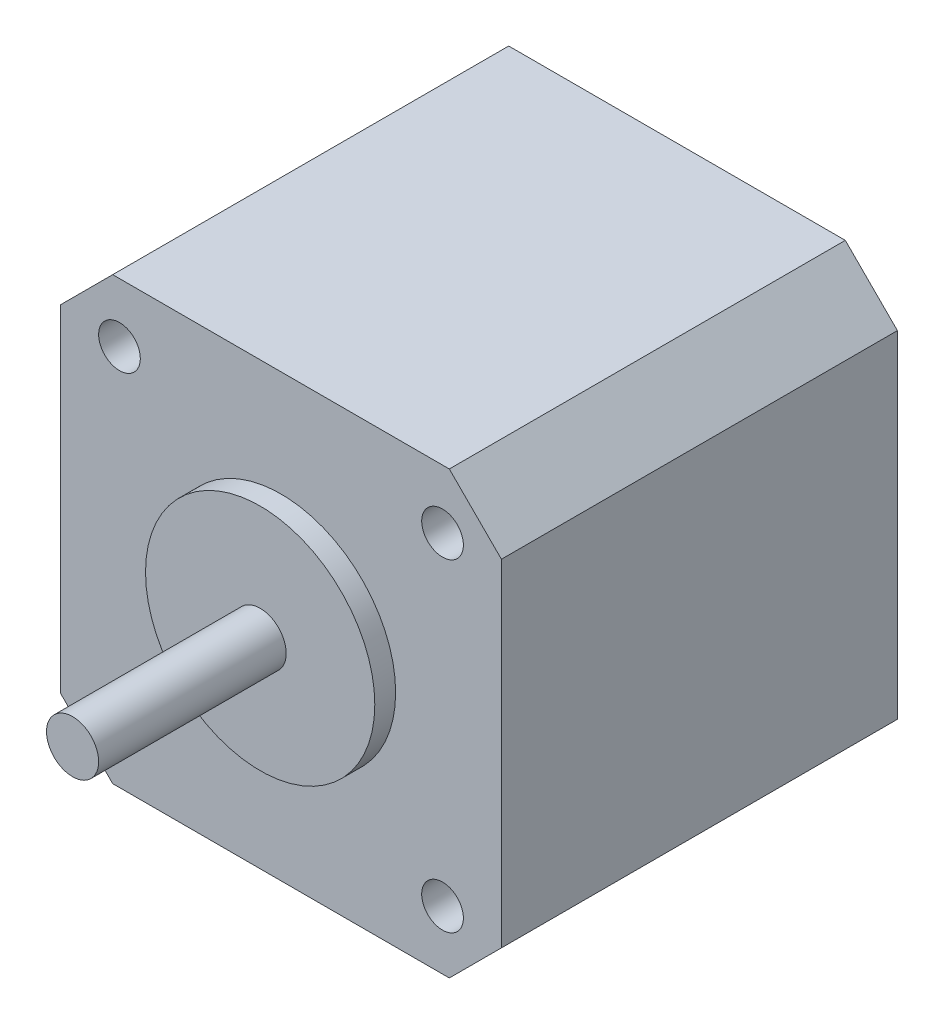
ISO-10303-21;
HEADER;
FILE_DESCRIPTION(('STEP AP214'),'2;1');
FILE_NAME('part.step','',(''),(''),'','','');
FILE_SCHEMA(('AUTOMOTIVE_DESIGN { 1 0 10303 214 1 1 1 1 }'));
ENDSEC;
DATA;
#1=APPLICATION_CONTEXT('core data for automotive mechanical design processes');
#2=APPLICATION_PROTOCOL_DEFINITION('international standard','automotive_design',2000,#1);
#3=PRODUCT_CONTEXT('',#1,'mechanical');
#4=PRODUCT('Part','Part','',(#3));
#5=PRODUCT_RELATED_PRODUCT_CATEGORY('part','',(#4));
#6=PRODUCT_DEFINITION_FORMATION('','',#4);
#7=PRODUCT_DEFINITION_CONTEXT('part definition',#1,'design');
#8=PRODUCT_DEFINITION('design','',#6,#7);
#9=PRODUCT_DEFINITION_SHAPE('','',#8);
#10=(LENGTH_UNIT() NAMED_UNIT(*) SI_UNIT(.MILLI.,.METRE.));
#11=(NAMED_UNIT(*) PLANE_ANGLE_UNIT() SI_UNIT($,.RADIAN.));
#12=(NAMED_UNIT(*) SI_UNIT($,.STERADIAN.) SOLID_ANGLE_UNIT());
#13=UNCERTAINTY_MEASURE_WITH_UNIT(LENGTH_MEASURE(1.E-05),#10,'distance_accuracy_value','');
#14=(GEOMETRIC_REPRESENTATION_CONTEXT(3) GLOBAL_UNCERTAINTY_ASSIGNED_CONTEXT((#13)) GLOBAL_UNIT_ASSIGNED_CONTEXT((#10,
#11,#12)) REPRESENTATION_CONTEXT('',''));
#15=CARTESIAN_POINT('',(0.,0.,0.));
#16=DIRECTION('',(0.,0.,1.));
#17=DIRECTION('',(1.,0.,0.));
#18=AXIS2_PLACEMENT_3D('',#15,#16,#17);
#19=CARTESIAN_POINT('',(21.15,-21.15,38.));
#20=DIRECTION('',(-1.,0.,0.));
#21=DIRECTION('',(0.,0.,1.));
#22=AXIS2_PLACEMENT_3D('',#19,#20,#21);
#23=PLANE('',#22);
#24=DIRECTION('',(0.,1.,0.));
#25=VECTOR('',#24,1.);
#26=CARTESIAN_POINT('',(21.15,-21.15,38.));
#27=LINE('',#26,#25);
#28=CARTESIAN_POINT('',(21.15,-16.15,38.));
#29=VERTEX_POINT('',#28);
#30=CARTESIAN_POINT('',(21.15,16.15,38.));
#31=VERTEX_POINT('',#30);
#32=EDGE_CURVE('E122',#29,#31,#27,.T.);
#33=ORIENTED_EDGE('',*,*,#32,.F.);
#34=DIRECTION('',(0.,0.,-1.));
#35=VECTOR('',#34,1.);
#36=CARTESIAN_POINT('',(21.15,-16.15,0.));
#37=LINE('',#36,#35);
#38=CARTESIAN_POINT('',(21.15,-16.15,0.));
#39=VERTEX_POINT('',#38);
#40=EDGE_CURVE('E107',#29,#39,#37,.T.);
#41=ORIENTED_EDGE('',*,*,#40,.T.);
#42=DIRECTION('',(0.,1.,0.));
#43=VECTOR('',#42,1.);
#44=CARTESIAN_POINT('',(21.15,-21.15,0.));
#45=LINE('',#44,#43);
#46=CARTESIAN_POINT('',(21.15,16.15,0.));
#47=VERTEX_POINT('',#46);
#48=EDGE_CURVE('E119',#39,#47,#45,.T.);
#49=ORIENTED_EDGE('',*,*,#48,.T.);
#50=DIRECTION('',(0.,0.,1.));
#51=VECTOR('',#50,1.);
#52=CARTESIAN_POINT('',(21.15,16.15,38.));
#53=LINE('',#52,#51);
#54=EDGE_CURVE('E124',#47,#31,#53,.T.);
#55=ORIENTED_EDGE('',*,*,#54,.T.);
#56=EDGE_LOOP('',(#33,#41,#49,#55));
#57=FACE_BOUND('',#56,.T.);
#58=ADVANCED_FACE('F34',(#57),#23,.F.);
#59=CARTESIAN_POINT('',(21.15,21.15,38.));
#60=DIRECTION('',(0.,-1.,0.));
#61=DIRECTION('',(1.,0.,0.));
#62=AXIS2_PLACEMENT_3D('',#59,#60,#61);
#63=PLANE('',#62);
#64=DIRECTION('',(-1.,0.,0.));
#65=VECTOR('',#64,1.);
#66=CARTESIAN_POINT('',(21.15,21.15,0.));
#67=LINE('',#66,#65);
#68=CARTESIAN_POINT('',(16.15,21.15,0.));
#69=VERTEX_POINT('',#68);
#70=CARTESIAN_POINT('',(-16.15,21.15,0.));
#71=VERTEX_POINT('',#70);
#72=EDGE_CURVE('E128',#69,#71,#67,.T.);
#73=ORIENTED_EDGE('',*,*,#72,.T.);
#74=DIRECTION('',(0.,0.,1.));
#75=VECTOR('',#74,1.);
#76=CARTESIAN_POINT('',(-16.15,21.15,38.));
#77=LINE('',#76,#75);
#78=CARTESIAN_POINT('',(-16.15,21.15,38.));
#79=VERTEX_POINT('',#78);
#80=EDGE_CURVE('E38',#71,#79,#77,.T.);
#81=ORIENTED_EDGE('',*,*,#80,.T.);
#82=DIRECTION('',(-1.,0.,0.));
#83=VECTOR('',#82,1.);
#84=CARTESIAN_POINT('',(21.15,21.15,38.));
#85=LINE('',#84,#83);
#86=CARTESIAN_POINT('',(16.15,21.15,38.));
#87=VERTEX_POINT('',#86);
#88=EDGE_CURVE('E197',#87,#79,#85,.T.);
#89=ORIENTED_EDGE('',*,*,#88,.F.);
#90=DIRECTION('',(0.,0.,-1.));
#91=VECTOR('',#90,1.);
#92=CARTESIAN_POINT('',(16.15,21.15,38.));
#93=LINE('',#92,#91);
#94=EDGE_CURVE('E163',#87,#69,#93,.T.);
#95=ORIENTED_EDGE('',*,*,#94,.T.);
#96=EDGE_LOOP('',(#73,#81,#89,#95));
#97=FACE_BOUND('',#96,.T.);
#98=ADVANCED_FACE('F211',(#97),#63,.F.);
#99=CARTESIAN_POINT('',(-21.15,-21.15,38.));
#100=DIRECTION('',(-1.,0.,0.));
#101=DIRECTION('',(0.,0.,1.));
#102=AXIS2_PLACEMENT_3D('',#99,#100,#101);
#103=PLANE('',#102);
#104=DIRECTION('',(0.,1.,0.));
#105=VECTOR('',#104,1.);
#106=CARTESIAN_POINT('',(-21.15,-21.15,0.));
#107=LINE('',#106,#105);
#108=CARTESIAN_POINT('',(-21.15,-16.15,0.));
#109=VERTEX_POINT('',#108);
#110=CARTESIAN_POINT('',(-21.15,16.15,0.));
#111=VERTEX_POINT('',#110);
#112=EDGE_CURVE('E132',#109,#111,#107,.T.);
#113=ORIENTED_EDGE('',*,*,#112,.F.);
#114=DIRECTION('',(0.,0.,1.));
#115=VECTOR('',#114,1.);
#116=CARTESIAN_POINT('',(-21.15,-16.15,38.));
#117=LINE('',#116,#115);
#118=CARTESIAN_POINT('',(-21.15,-16.15,38.));
#119=VERTEX_POINT('',#118);
#120=EDGE_CURVE('E58',#109,#119,#117,.T.);
#121=ORIENTED_EDGE('',*,*,#120,.T.);
#122=DIRECTION('',(0.,1.,0.));
#123=VECTOR('',#122,1.);
#124=CARTESIAN_POINT('',(-21.15,-21.15,38.));
#125=LINE('',#124,#123);
#126=CARTESIAN_POINT('',(-21.15,16.15,38.));
#127=VERTEX_POINT('',#126);
#128=EDGE_CURVE('E198',#119,#127,#125,.T.);
#129=ORIENTED_EDGE('',*,*,#128,.T.);
#130=DIRECTION('',(0.,0.,-1.));
#131=VECTOR('',#130,1.);
#132=CARTESIAN_POINT('',(-21.15,16.15,0.));
#133=LINE('',#132,#131);
#134=EDGE_CURVE('E160',#127,#111,#133,.T.);
#135=ORIENTED_EDGE('',*,*,#134,.T.);
#136=EDGE_LOOP('',(#113,#121,#129,#135));
#137=FACE_BOUND('',#136,.T.);
#138=ADVANCED_FACE('F208',(#137),#103,.T.);
#139=CARTESIAN_POINT('',(21.15,-21.15,38.));
#140=DIRECTION('',(0.,-1.,0.));
#141=DIRECTION('',(1.,0.,0.));
#142=AXIS2_PLACEMENT_3D('',#139,#140,#141);
#143=PLANE('',#142);
#144=DIRECTION('',(-1.,0.,0.));
#145=VECTOR('',#144,1.);
#146=CARTESIAN_POINT('',(21.15,-21.15,0.));
#147=LINE('',#146,#145);
#148=CARTESIAN_POINT('',(16.15,-21.15,0.));
#149=VERTEX_POINT('',#148);
#150=CARTESIAN_POINT('',(-16.15,-21.15,0.));
#151=VERTEX_POINT('',#150);
#152=EDGE_CURVE('E143',#149,#151,#147,.T.);
#153=ORIENTED_EDGE('',*,*,#152,.F.);
#154=DIRECTION('',(0.,0.,1.));
#155=VECTOR('',#154,1.);
#156=CARTESIAN_POINT('',(16.15,-21.15,38.));
#157=LINE('',#156,#155);
#158=CARTESIAN_POINT('',(16.15,-21.15,38.));
#159=VERTEX_POINT('',#158);
#160=EDGE_CURVE('E108',#149,#159,#157,.T.);
#161=ORIENTED_EDGE('',*,*,#160,.T.);
#162=DIRECTION('',(-1.,0.,0.));
#163=VECTOR('',#162,1.);
#164=CARTESIAN_POINT('',(21.15,-21.15,38.));
#165=LINE('',#164,#163);
#166=CARTESIAN_POINT('',(-16.15,-21.15,38.));
#167=VERTEX_POINT('',#166);
#168=EDGE_CURVE('E138',#159,#167,#165,.T.);
#169=ORIENTED_EDGE('',*,*,#168,.T.);
#170=DIRECTION('',(0.,0.,-1.));
#171=VECTOR('',#170,1.);
#172=CARTESIAN_POINT('',(-16.15,-21.15,38.));
#173=LINE('',#172,#171);
#174=EDGE_CURVE('E113',#167,#151,#173,.T.);
#175=ORIENTED_EDGE('',*,*,#174,.T.);
#176=EDGE_LOOP('',(#153,#161,#169,#175));
#177=FACE_BOUND('',#176,.T.);
#178=ADVANCED_FACE('F204',(#177),#143,.T.);
#179=CARTESIAN_POINT('',(0.,0.,38.));
#180=DIRECTION('',(0.,0.,1.));
#181=DIRECTION('',(1.,0.,0.));
#182=AXIS2_PLACEMENT_3D('',#179,#180,#181);
#183=PLANE('',#182);
#184=CARTESIAN_POINT('',(0.,0.,38.));
#185=DIRECTION('',(0.,0.,1.));
#186=DIRECTION('',(1.,0.,0.));
#187=AXIS2_PLACEMENT_3D('',#184,#185,#186);
#188=CIRCLE('',#187,11.);
#189=CARTESIAN_POINT('',(11.,0.,38.));
#190=VERTEX_POINT('',#189);
#191=EDGE_CURVE('E43',#190,#190,#188,.T.);
#192=ORIENTED_EDGE('',*,*,#191,.F.);
#193=EDGE_LOOP('',(#192));
#194=FACE_BOUND('',#193,.T.);
#195=CARTESIAN_POINT('',(15.5,15.5,38.));
#196=DIRECTION('',(0.,0.,1.));
#197=DIRECTION('',(1.,0.,0.));
#198=AXIS2_PLACEMENT_3D('',#195,#196,#197);
#199=CIRCLE('',#198,2.);
#200=CARTESIAN_POINT('',(17.5,15.5,38.));
#201=VERTEX_POINT('',#200);
#202=EDGE_CURVE('E186',#201,#201,#199,.T.);
#203=ORIENTED_EDGE('',*,*,#202,.F.);
#204=EDGE_LOOP('',(#203));
#205=FACE_BOUND('',#204,.T.);
#206=CARTESIAN_POINT('',(-15.5,-15.5,38.));
#207=DIRECTION('',(0.,0.,1.));
#208=DIRECTION('',(1.,0.,0.));
#209=AXIS2_PLACEMENT_3D('',#206,#207,#208);
#210=CIRCLE('',#209,2.);
#211=CARTESIAN_POINT('',(-13.5,-15.5,38.));
#212=VERTEX_POINT('',#211);
#213=EDGE_CURVE('E179',#212,#212,#210,.T.);
#214=ORIENTED_EDGE('',*,*,#213,.F.);
#215=EDGE_LOOP('',(#214));
#216=FACE_BOUND('',#215,.T.);
#217=CARTESIAN_POINT('',(15.5,-15.5,38.));
#218=DIRECTION('',(0.,0.,1.));
#219=DIRECTION('',(1.,0.,0.));
#220=AXIS2_PLACEMENT_3D('',#217,#218,#219);
#221=CIRCLE('',#220,2.);
#222=CARTESIAN_POINT('',(17.5,-15.5,38.));
#223=VERTEX_POINT('',#222);
#224=EDGE_CURVE('E180',#223,#223,#221,.T.);
#225=ORIENTED_EDGE('',*,*,#224,.F.);
#226=EDGE_LOOP('',(#225));
#227=FACE_BOUND('',#226,.T.);
#228=CARTESIAN_POINT('',(-15.5,15.5,38.));
#229=DIRECTION('',(0.,0.,1.));
#230=DIRECTION('',(1.,0.,0.));
#231=AXIS2_PLACEMENT_3D('',#228,#229,#230);
#232=CIRCLE('',#231,2.);
#233=CARTESIAN_POINT('',(-13.5,15.5,38.));
#234=VERTEX_POINT('',#233);
#235=EDGE_CURVE('E135',#234,#234,#232,.T.);
#236=ORIENTED_EDGE('',*,*,#235,.F.);
#237=EDGE_LOOP('',(#236));
#238=FACE_BOUND('',#237,.T.);
#239=ORIENTED_EDGE('',*,*,#168,.F.);
#240=DIRECTION('',(0.707106781186549,0.707106781186546,0.));
#241=VECTOR('',#240,1.);
#242=CARTESIAN_POINT('',(18.65,-18.65,38.));
#243=LINE('',#242,#241);
#244=EDGE_CURVE('E158',#159,#29,#243,.T.);
#245=ORIENTED_EDGE('',*,*,#244,.T.);
#246=ORIENTED_EDGE('',*,*,#32,.T.);
#247=DIRECTION('',(0.707106781186546,-0.707106781186549,0.));
#248=VECTOR('',#247,1.);
#249=CARTESIAN_POINT('',(18.65,18.65,38.));
#250=LINE('',#249,#248);
#251=EDGE_CURVE('E153',#31,#87,#250,.F.);
#252=ORIENTED_EDGE('',*,*,#251,.T.);
#253=ORIENTED_EDGE('',*,*,#88,.T.);
#254=DIRECTION('',(-0.707106781186549,-0.707106781186546,0.));
#255=VECTOR('',#254,1.);
#256=CARTESIAN_POINT('',(-18.65,18.65,38.));
#257=LINE('',#256,#255);
#258=EDGE_CURVE('E51',#79,#127,#257,.T.);
#259=ORIENTED_EDGE('',*,*,#258,.T.);
#260=ORIENTED_EDGE('',*,*,#128,.F.);
#261=DIRECTION('',(-0.707106781186547,0.707106781186549,0.));
#262=VECTOR('',#261,1.);
#263=CARTESIAN_POINT('',(-18.65,-18.65,38.));
#264=LINE('',#263,#262);
#265=EDGE_CURVE('E156',#119,#167,#264,.F.);
#266=ORIENTED_EDGE('',*,*,#265,.T.);
#267=EDGE_LOOP('',(#239,#245,#246,#252,#253,#259,#260,#266));
#268=FACE_BOUND('',#267,.T.);
#269=ADVANCED_FACE('F238',(#194,#205,#216,#227,#238,#268),#183,.T.);
#270=CARTESIAN_POINT('',(0.,0.,0.));
#271=DIRECTION('',(0.,0.,1.));
#272=DIRECTION('',(1.,0.,0.));
#273=AXIS2_PLACEMENT_3D('',#270,#271,#272);
#274=PLANE('',#273);
#275=ORIENTED_EDGE('',*,*,#48,.F.);
#276=DIRECTION('',(-0.707106781186549,-0.707106781186546,0.));
#277=VECTOR('',#276,1.);
#278=CARTESIAN_POINT('',(21.15,-16.15,0.));
#279=LINE('',#278,#277);
#280=EDGE_CURVE('E103',#39,#149,#279,.T.);
#281=ORIENTED_EDGE('',*,*,#280,.T.);
#282=ORIENTED_EDGE('',*,*,#152,.T.);
#283=DIRECTION('',(0.707106781186547,-0.707106781186549,0.));
#284=VECTOR('',#283,1.);
#285=CARTESIAN_POINT('',(-16.15,-21.15,0.));
#286=LINE('',#285,#284);
#287=EDGE_CURVE('E114',#151,#109,#286,.F.);
#288=ORIENTED_EDGE('',*,*,#287,.T.);
#289=ORIENTED_EDGE('',*,*,#112,.T.);
#290=DIRECTION('',(0.707106781186549,0.707106781186546,0.));
#291=VECTOR('',#290,1.);
#292=CARTESIAN_POINT('',(-21.15,16.15,0.));
#293=LINE('',#292,#291);
#294=EDGE_CURVE('E147',#111,#71,#293,.T.);
#295=ORIENTED_EDGE('',*,*,#294,.T.);
#296=ORIENTED_EDGE('',*,*,#72,.F.);
#297=DIRECTION('',(-0.707106781186546,0.707106781186549,0.));
#298=VECTOR('',#297,1.);
#299=CARTESIAN_POINT('',(16.15,21.15,0.));
#300=LINE('',#299,#298);
#301=EDGE_CURVE('E123',#69,#47,#300,.F.);
#302=ORIENTED_EDGE('',*,*,#301,.T.);
#303=EDGE_LOOP('',(#275,#281,#282,#288,#289,#295,#296,#302));
#304=FACE_BOUND('',#303,.T.);
#305=ADVANCED_FACE('F126',(#304),#274,.F.);
#306=CARTESIAN_POINT('',(21.15,-16.15,38.));
#307=DIRECTION('',(0.707106781186546,-0.707106781186549,0.));
#308=DIRECTION('',(0.,0.,1.));
#309=AXIS2_PLACEMENT_3D('',#306,#307,#308);
#310=PLANE('',#309);
#311=ORIENTED_EDGE('',*,*,#244,.F.);
#312=ORIENTED_EDGE('',*,*,#160,.F.);
#313=ORIENTED_EDGE('',*,*,#280,.F.);
#314=ORIENTED_EDGE('',*,*,#40,.F.);
#315=EDGE_LOOP('',(#311,#312,#313,#314));
#316=FACE_BOUND('',#315,.T.);
#317=ADVANCED_FACE('F106',(#316),#310,.T.);
#318=CARTESIAN_POINT('',(-16.15,-21.15,38.));
#319=DIRECTION('',(0.707106781186548,0.707106781186546,0.));
#320=DIRECTION('',(0.,0.,-1.));
#321=AXIS2_PLACEMENT_3D('',#318,#319,#320);
#322=PLANE('',#321);
#323=ORIENTED_EDGE('',*,*,#265,.F.);
#324=ORIENTED_EDGE('',*,*,#120,.F.);
#325=ORIENTED_EDGE('',*,*,#287,.F.);
#326=ORIENTED_EDGE('',*,*,#174,.F.);
#327=EDGE_LOOP('',(#323,#324,#325,#326));
#328=FACE_BOUND('',#327,.T.);
#329=ADVANCED_FACE('F207',(#328),#322,.F.);
#330=CARTESIAN_POINT('',(-21.15,16.15,38.));
#331=DIRECTION('',(-0.707106781186546,0.707106781186549,0.));
#332=DIRECTION('',(0.,0.,1.));
#333=AXIS2_PLACEMENT_3D('',#330,#331,#332);
#334=PLANE('',#333);
#335=ORIENTED_EDGE('',*,*,#258,.F.);
#336=ORIENTED_EDGE('',*,*,#80,.F.);
#337=ORIENTED_EDGE('',*,*,#294,.F.);
#338=ORIENTED_EDGE('',*,*,#134,.F.);
#339=EDGE_LOOP('',(#335,#336,#337,#338));
#340=FACE_BOUND('',#339,.T.);
#341=ADVANCED_FACE('F210',(#340),#334,.T.);
#342=CARTESIAN_POINT('',(16.15,21.15,38.));
#343=DIRECTION('',(-0.707106781186549,-0.707106781186546,0.));
#344=DIRECTION('',(0.,0.,-1.));
#345=AXIS2_PLACEMENT_3D('',#342,#343,#344);
#346=PLANE('',#345);
#347=ORIENTED_EDGE('',*,*,#251,.F.);
#348=ORIENTED_EDGE('',*,*,#54,.F.);
#349=ORIENTED_EDGE('',*,*,#301,.F.);
#350=ORIENTED_EDGE('',*,*,#94,.F.);
#351=EDGE_LOOP('',(#347,#348,#349,#350));
#352=FACE_BOUND('',#351,.T.);
#353=ADVANCED_FACE('F36',(#352),#346,.F.);
#354=CARTESIAN_POINT('',(-15.5,15.5,33.));
#355=DIRECTION('',(0.,0.,1.));
#356=DIRECTION('',(1.,0.,0.));
#357=AXIS2_PLACEMENT_3D('',#354,#355,#356);
#358=CYLINDRICAL_SURFACE('',#357,2.);
#359=CARTESIAN_POINT('',(-15.5,15.5,33.));
#360=DIRECTION('',(0.,0.,1.));
#361=DIRECTION('',(1.,0.,0.));
#362=AXIS2_PLACEMENT_3D('',#359,#360,#361);
#363=CIRCLE('',#362,2.);
#364=CARTESIAN_POINT('',(-13.5,15.5,33.));
#365=VERTEX_POINT('',#364);
#366=EDGE_CURVE('E129',#365,#365,#363,.T.);
#367=ORIENTED_EDGE('',*,*,#366,.F.);
#368=EDGE_LOOP('',(#367));
#369=FACE_BOUND('',#368,.T.);
#370=ORIENTED_EDGE('',*,*,#235,.T.);
#371=EDGE_LOOP('',(#370));
#372=FACE_BOUND('',#371,.T.);
#373=ADVANCED_FACE('F229',(#369,#372),#358,.F.);
#374=CARTESIAN_POINT('',(-15.5,15.5,33.));
#375=DIRECTION('',(0.,0.,1.));
#376=DIRECTION('',(1.,0.,0.));
#377=AXIS2_PLACEMENT_3D('',#374,#375,#376);
#378=PLANE('',#377);
#379=ORIENTED_EDGE('',*,*,#366,.T.);
#380=EDGE_LOOP('',(#379));
#381=FACE_BOUND('',#380,.T.);
#382=ADVANCED_FACE('F234',(#381),#378,.T.);
#383=CARTESIAN_POINT('',(15.5,-15.5,33.));
#384=DIRECTION('',(0.,0.,1.));
#385=DIRECTION('',(1.,0.,0.));
#386=AXIS2_PLACEMENT_3D('',#383,#384,#385);
#387=CYLINDRICAL_SURFACE('',#386,2.);
#388=CARTESIAN_POINT('',(15.5,-15.5,33.));
#389=DIRECTION('',(0.,0.,1.));
#390=DIRECTION('',(1.,0.,0.));
#391=AXIS2_PLACEMENT_3D('',#388,#389,#390);
#392=CIRCLE('',#391,2.);
#393=CARTESIAN_POINT('',(17.5,-15.5,33.));
#394=VERTEX_POINT('',#393);
#395=EDGE_CURVE('E176',#394,#394,#392,.T.);
#396=ORIENTED_EDGE('',*,*,#395,.F.);
#397=EDGE_LOOP('',(#396));
#398=FACE_BOUND('',#397,.T.);
#399=ORIENTED_EDGE('',*,*,#224,.T.);
#400=EDGE_LOOP('',(#399));
#401=FACE_BOUND('',#400,.T.);
#402=ADVANCED_FACE('F251',(#398,#401),#387,.F.);
#403=CARTESIAN_POINT('',(15.5,-15.5,33.));
#404=DIRECTION('',(0.,0.,1.));
#405=DIRECTION('',(1.,0.,0.));
#406=AXIS2_PLACEMENT_3D('',#403,#404,#405);
#407=PLANE('',#406);
#408=ORIENTED_EDGE('',*,*,#395,.T.);
#409=EDGE_LOOP('',(#408));
#410=FACE_BOUND('',#409,.T.);
#411=ADVANCED_FACE('F257',(#410),#407,.T.);
#412=CARTESIAN_POINT('',(-15.5,-15.5,33.));
#413=DIRECTION('',(0.,0.,1.));
#414=DIRECTION('',(1.,0.,0.));
#415=AXIS2_PLACEMENT_3D('',#412,#413,#414);
#416=CYLINDRICAL_SURFACE('',#415,2.);
#417=CARTESIAN_POINT('',(-15.5,-15.5,33.));
#418=DIRECTION('',(0.,0.,1.));
#419=DIRECTION('',(1.,0.,0.));
#420=AXIS2_PLACEMENT_3D('',#417,#418,#419);
#421=CIRCLE('',#420,2.);
#422=CARTESIAN_POINT('',(-13.5,-15.5,33.));
#423=VERTEX_POINT('',#422);
#424=EDGE_CURVE('E189',#423,#423,#421,.T.);
#425=ORIENTED_EDGE('',*,*,#424,.F.);
#426=EDGE_LOOP('',(#425));
#427=FACE_BOUND('',#426,.T.);
#428=ORIENTED_EDGE('',*,*,#213,.T.);
#429=EDGE_LOOP('',(#428));
#430=FACE_BOUND('',#429,.T.);
#431=ADVANCED_FACE('F253',(#427,#430),#416,.F.);
#432=CARTESIAN_POINT('',(-15.5,-15.5,33.));
#433=DIRECTION('',(0.,0.,1.));
#434=DIRECTION('',(1.,0.,0.));
#435=AXIS2_PLACEMENT_3D('',#432,#433,#434);
#436=PLANE('',#435);
#437=ORIENTED_EDGE('',*,*,#424,.T.);
#438=EDGE_LOOP('',(#437));
#439=FACE_BOUND('',#438,.T.);
#440=ADVANCED_FACE('F256',(#439),#436,.T.);
#441=CARTESIAN_POINT('',(15.5,15.5,33.));
#442=DIRECTION('',(0.,0.,1.));
#443=DIRECTION('',(1.,0.,0.));
#444=AXIS2_PLACEMENT_3D('',#441,#442,#443);
#445=CYLINDRICAL_SURFACE('',#444,2.);
#446=CARTESIAN_POINT('',(15.5,15.5,33.));
#447=DIRECTION('',(0.,0.,1.));
#448=DIRECTION('',(1.,0.,0.));
#449=AXIS2_PLACEMENT_3D('',#446,#447,#448);
#450=CIRCLE('',#449,2.);
#451=CARTESIAN_POINT('',(17.5,15.5,33.));
#452=VERTEX_POINT('',#451);
#453=EDGE_CURVE('E183',#452,#452,#450,.T.);
#454=ORIENTED_EDGE('',*,*,#453,.F.);
#455=EDGE_LOOP('',(#454));
#456=FACE_BOUND('',#455,.T.);
#457=ORIENTED_EDGE('',*,*,#202,.T.);
#458=EDGE_LOOP('',(#457));
#459=FACE_BOUND('',#458,.T.);
#460=ADVANCED_FACE('F261',(#456,#459),#445,.F.);
#461=CARTESIAN_POINT('',(15.5,15.5,33.));
#462=DIRECTION('',(0.,0.,1.));
#463=DIRECTION('',(1.,0.,0.));
#464=AXIS2_PLACEMENT_3D('',#461,#462,#463);
#465=PLANE('',#464);
#466=ORIENTED_EDGE('',*,*,#453,.T.);
#467=EDGE_LOOP('',(#466));
#468=FACE_BOUND('',#467,.T.);
#469=ADVANCED_FACE('F265',(#468),#465,.T.);
#470=CARTESIAN_POINT('',(0.,0.,40.));
#471=DIRECTION('',(0.,0.,-1.));
#472=DIRECTION('',(-1.,0.,0.));
#473=AXIS2_PLACEMENT_3D('',#470,#471,#472);
#474=CYLINDRICAL_SURFACE('',#473,11.);
#475=CARTESIAN_POINT('',(0.,0.,40.));
#476=DIRECTION('',(0.,0.,1.));
#477=DIRECTION('',(1.,0.,0.));
#478=AXIS2_PLACEMENT_3D('',#475,#476,#477);
#479=CIRCLE('',#478,11.);
#480=CARTESIAN_POINT('',(11.,0.,40.));
#481=VERTEX_POINT('',#480);
#482=EDGE_CURVE('E175',#481,#481,#479,.T.);
#483=ORIENTED_EDGE('',*,*,#482,.F.);
#484=EDGE_LOOP('',(#483));
#485=FACE_BOUND('',#484,.T.);
#486=ORIENTED_EDGE('',*,*,#191,.T.);
#487=EDGE_LOOP('',(#486));
#488=FACE_BOUND('',#487,.T.);
#489=ADVANCED_FACE('F269',(#485,#488),#474,.T.);
#490=CARTESIAN_POINT('',(0.,0.,40.));
#491=DIRECTION('',(0.,0.,1.));
#492=DIRECTION('',(1.,0.,0.));
#493=AXIS2_PLACEMENT_3D('',#490,#491,#492);
#494=PLANE('',#493);
#495=CARTESIAN_POINT('',(0.,0.,40.));
#496=DIRECTION('',(0.,0.,1.));
#497=DIRECTION('',(1.,0.,0.));
#498=AXIS2_PLACEMENT_3D('',#495,#496,#497);
#499=CIRCLE('',#498,2.5);
#500=CARTESIAN_POINT('',(2.5,0.,40.));
#501=VERTEX_POINT('',#500);
#502=EDGE_CURVE('E11',#501,#501,#499,.T.);
#503=ORIENTED_EDGE('',*,*,#502,.F.);
#504=EDGE_LOOP('',(#503));
#505=FACE_BOUND('',#504,.T.);
#506=ORIENTED_EDGE('',*,*,#482,.T.);
#507=EDGE_LOOP('',(#506));
#508=FACE_BOUND('',#507,.T.);
#509=ADVANCED_FACE('F279',(#505,#508),#494,.T.);
#510=CARTESIAN_POINT('',(0.,0.,58.));
#511=DIRECTION('',(0.,0.,-1.));
#512=DIRECTION('',(-1.,0.,0.));
#513=AXIS2_PLACEMENT_3D('',#510,#511,#512);
#514=CYLINDRICAL_SURFACE('',#513,2.5);
#515=CARTESIAN_POINT('',(0.,0.,58.));
#516=DIRECTION('',(0.,0.,1.));
#517=DIRECTION('',(1.,0.,0.));
#518=AXIS2_PLACEMENT_3D('',#515,#516,#517);
#519=CIRCLE('',#518,2.5);
#520=CARTESIAN_POINT('',(2.5,0.,58.));
#521=VERTEX_POINT('',#520);
#522=EDGE_CURVE('E295',#521,#521,#519,.T.);
#523=ORIENTED_EDGE('',*,*,#522,.F.);
#524=EDGE_LOOP('',(#523));
#525=FACE_BOUND('',#524,.T.);
#526=ORIENTED_EDGE('',*,*,#502,.T.);
#527=EDGE_LOOP('',(#526));
#528=FACE_BOUND('',#527,.T.);
#529=ADVANCED_FACE('F283',(#525,#528),#514,.T.);
#530=CARTESIAN_POINT('',(0.,0.,58.));
#531=DIRECTION('',(0.,0.,1.));
#532=DIRECTION('',(1.,0.,0.));
#533=AXIS2_PLACEMENT_3D('',#530,#531,#532);
#534=PLANE('',#533);
#535=ORIENTED_EDGE('',*,*,#522,.T.);
#536=EDGE_LOOP('',(#535));
#537=FACE_BOUND('',#536,.T.);
#538=ADVANCED_FACE('F287',(#537),#534,.T.);
#539=CLOSED_SHELL('',(#58,#98,#138,#178,#269,#305,#317,#329,#341,#353,#373,#382,#402,#411,#431,
#440,#460,#469,#489,#509,#529,#538));
#540=MANIFOLD_SOLID_BREP('B2',#539);
#541=ADVANCED_BREP_SHAPE_REPRESENTATION('',(#18,#540),#14);
#542=SHAPE_DEFINITION_REPRESENTATION(#9,#541);
ENDSEC;
END-ISO-10303-21;
